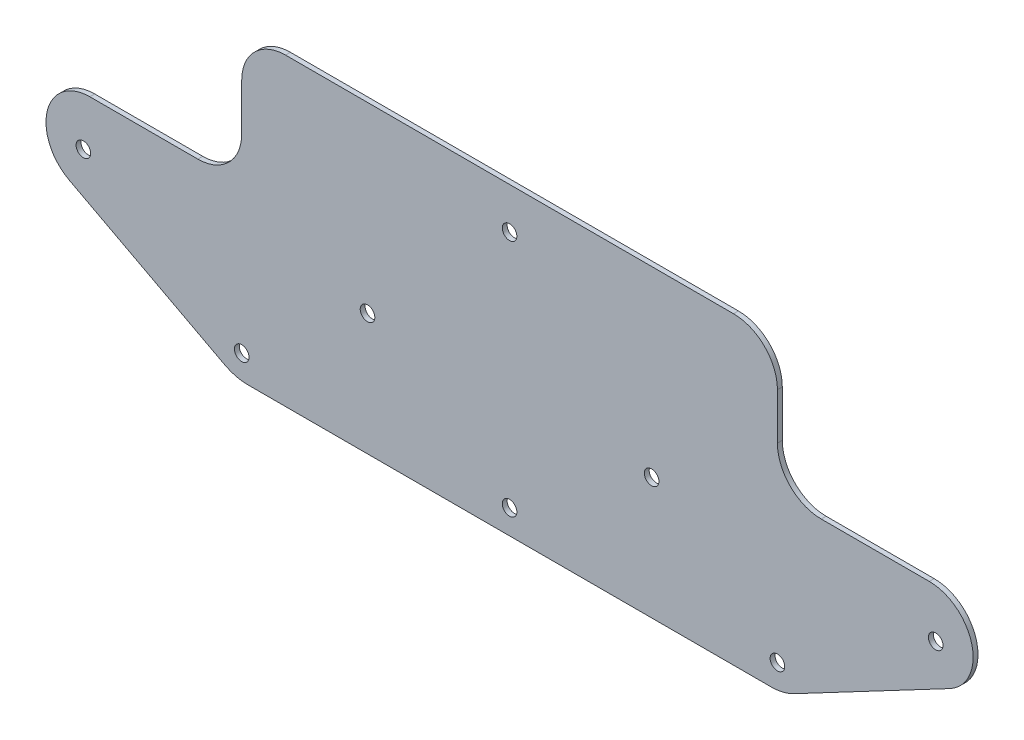
ISO-10303-21;
HEADER;
FILE_DESCRIPTION(('STEP AP214'),'2;1');
FILE_NAME('part.step','',(''),(''),'','','');
FILE_SCHEMA(('AUTOMOTIVE_DESIGN { 1 0 10303 214 1 1 1 1 }'));
ENDSEC;
DATA;
#1=APPLICATION_CONTEXT('core data for automotive mechanical design processes');
#2=APPLICATION_PROTOCOL_DEFINITION('international standard','automotive_design',2000,#1);
#3=PRODUCT_CONTEXT('',#1,'mechanical');
#4=PRODUCT('Part','Part','',(#3));
#5=PRODUCT_RELATED_PRODUCT_CATEGORY('part','',(#4));
#6=PRODUCT_DEFINITION_FORMATION('','',#4);
#7=PRODUCT_DEFINITION_CONTEXT('part definition',#1,'design');
#8=PRODUCT_DEFINITION('design','',#6,#7);
#9=PRODUCT_DEFINITION_SHAPE('','',#8);
#10=(LENGTH_UNIT() NAMED_UNIT(*) SI_UNIT(.MILLI.,.METRE.));
#11=(NAMED_UNIT(*) PLANE_ANGLE_UNIT() SI_UNIT($,.RADIAN.));
#12=(NAMED_UNIT(*) SI_UNIT($,.STERADIAN.) SOLID_ANGLE_UNIT());
#13=UNCERTAINTY_MEASURE_WITH_UNIT(LENGTH_MEASURE(1.E-05),#10,'distance_accuracy_value','');
#14=(GEOMETRIC_REPRESENTATION_CONTEXT(3) GLOBAL_UNCERTAINTY_ASSIGNED_CONTEXT((#13)) GLOBAL_UNIT_ASSIGNED_CONTEXT((#10,
#11,#12)) REPRESENTATION_CONTEXT('',''));
#15=CARTESIAN_POINT('',(0.,0.,0.));
#16=DIRECTION('',(0.,0.,1.));
#17=DIRECTION('',(1.,0.,0.));
#18=AXIS2_PLACEMENT_3D('',#15,#16,#17);
#19=CARTESIAN_POINT('',(0.,0.,2.));
#20=DIRECTION('',(0.,0.,-1.));
#21=DIRECTION('',(-1.,0.,0.));
#22=AXIS2_PLACEMENT_3D('',#19,#20,#21);
#23=PLANE('',#22);
#24=DIRECTION('',(0.884163522542753,-0.467177552334003,0.));
#25=VECTOR('',#24,1.);
#26=CARTESIAN_POINT('',(-244.958991581617,40.,2.));
#27=LINE('',#26,#25);
#28=CARTESIAN_POINT('',(-180.772782979186,6.08505659423045,2.));
#29=VERTEX_POINT('',#28);
#30=CARTESIAN_POINT('',(-116.864055255872,-27.6832704508551,2.));
#31=VERTEX_POINT('',#30);
#32=EDGE_CURVE('E180',#29,#31,#27,.T.);
#33=ORIENTED_EDGE('',*,*,#32,.T.);
#34=CARTESIAN_POINT('',(-107.520504209191,-10.,2.));
#35=DIRECTION('',(0.,0.,-1.));
#36=DIRECTION('',(-1.,0.,0.));
#37=AXIS2_PLACEMENT_3D('',#34,#35,#36);
#38=CIRCLE('',#37,20.);
#39=CARTESIAN_POINT('',(-107.520504209191,-30.,2.));
#40=VERTEX_POINT('',#39);
#41=EDGE_CURVE('E43',#31,#40,#38,.F.);
#42=ORIENTED_EDGE('',*,*,#41,.T.);
#43=DIRECTION('',(1.,0.,0.));
#44=VECTOR('',#43,1.);
#45=CARTESIAN_POINT('',(-112.479495790809,-30.,2.));
#46=LINE('',#45,#44);
#47=CARTESIAN_POINT('',(107.520504209191,-30.,2.));
#48=VERTEX_POINT('',#47);
#49=EDGE_CURVE('E183',#40,#48,#46,.T.);
#50=ORIENTED_EDGE('',*,*,#49,.T.);
#51=CARTESIAN_POINT('',(107.520504209191,-9.99999999999999,2.));
#52=DIRECTION('',(0.,0.,-1.));
#53=DIRECTION('',(-1.,0.,0.));
#54=AXIS2_PLACEMENT_3D('',#51,#52,#53);
#55=CIRCLE('',#54,20.);
#56=CARTESIAN_POINT('',(116.864055255872,-27.6832704508551,2.));
#57=VERTEX_POINT('',#56);
#58=EDGE_CURVE('E50',#48,#57,#55,.F.);
#59=ORIENTED_EDGE('',*,*,#58,.T.);
#60=DIRECTION('',(0.884163522542753,0.467177552334003,0.));
#61=VECTOR('',#60,1.);
#62=CARTESIAN_POINT('',(244.958991581617,40.,2.));
#63=LINE('',#62,#61);
#64=CARTESIAN_POINT('',(180.772782979186,6.08505659423045,2.));
#65=VERTEX_POINT('',#64);
#66=EDGE_CURVE('E253',#57,#65,#63,.T.);
#67=ORIENTED_EDGE('',*,*,#66,.T.);
#68=CARTESIAN_POINT('',(172.363587037174,22.,2.));
#69=DIRECTION('',(0.,0.,-1.));
#70=DIRECTION('',(-1.,0.,0.));
#71=AXIS2_PLACEMENT_3D('',#68,#69,#70);
#72=CIRCLE('',#71,18.);
#73=CARTESIAN_POINT('',(172.363587037174,40.,2.));
#74=VERTEX_POINT('',#73);
#75=EDGE_CURVE('E208',#65,#74,#72,.F.);
#76=ORIENTED_EDGE('',*,*,#75,.T.);
#77=DIRECTION('',(-1.,0.,0.));
#78=VECTOR('',#77,1.);
#79=CARTESIAN_POINT('',(110.,40.,2.));
#80=LINE('',#79,#78);
#81=CARTESIAN_POINT('',(128.,40.,2.));
#82=VERTEX_POINT('',#81);
#83=EDGE_CURVE('E299',#74,#82,#80,.T.);
#84=ORIENTED_EDGE('',*,*,#83,.T.);
#85=CARTESIAN_POINT('',(128.,58.,2.));
#86=DIRECTION('',(0.,0.,-1.));
#87=DIRECTION('',(-1.,0.,0.));
#88=AXIS2_PLACEMENT_3D('',#85,#86,#87);
#89=CIRCLE('',#88,18.);
#90=CARTESIAN_POINT('',(110.,58.,2.));
#91=VERTEX_POINT('',#90);
#92=EDGE_CURVE('E232',#82,#91,#89,.T.);
#93=ORIENTED_EDGE('',*,*,#92,.T.);
#94=DIRECTION('',(0.,1.,0.));
#95=VECTOR('',#94,1.);
#96=CARTESIAN_POINT('',(110.,95.0000000000001,2.));
#97=LINE('',#96,#95);
#98=CARTESIAN_POINT('',(110.,77.,2.));
#99=VERTEX_POINT('',#98);
#100=EDGE_CURVE('E294',#91,#99,#97,.T.);
#101=ORIENTED_EDGE('',*,*,#100,.T.);
#102=CARTESIAN_POINT('',(92.0000000000002,77.0000000000001,2.));
#103=DIRECTION('',(0.,0.,-1.));
#104=DIRECTION('',(-1.,0.,0.));
#105=AXIS2_PLACEMENT_3D('',#102,#103,#104);
#106=CIRCLE('',#105,18.);
#107=CARTESIAN_POINT('',(92.0000000000002,95.0000000000001,2.));
#108=VERTEX_POINT('',#107);
#109=EDGE_CURVE('E210',#99,#108,#106,.F.);
#110=ORIENTED_EDGE('',*,*,#109,.T.);
#111=DIRECTION('',(-1.,0.,0.));
#112=VECTOR('',#111,1.);
#113=CARTESIAN_POINT('',(110.,95.0000000000001,2.));
#114=LINE('',#113,#112);
#115=CARTESIAN_POINT('',(-92.0000000000001,95.0000000000001,2.));
#116=VERTEX_POINT('',#115);
#117=EDGE_CURVE('E291',#108,#116,#114,.T.);
#118=ORIENTED_EDGE('',*,*,#117,.T.);
#119=CARTESIAN_POINT('',(-92.0000000000001,77.0000000000001,2.));
#120=DIRECTION('',(0.,0.,-1.));
#121=DIRECTION('',(-1.,0.,0.));
#122=AXIS2_PLACEMENT_3D('',#119,#120,#121);
#123=CIRCLE('',#122,18.);
#124=CARTESIAN_POINT('',(-110.,77.0000000000001,2.));
#125=VERTEX_POINT('',#124);
#126=EDGE_CURVE('E212',#116,#125,#123,.F.);
#127=ORIENTED_EDGE('',*,*,#126,.T.);
#128=DIRECTION('',(0.,-1.,0.));
#129=VECTOR('',#128,1.);
#130=CARTESIAN_POINT('',(-110.,95.0000000000001,2.));
#131=LINE('',#130,#129);
#132=CARTESIAN_POINT('',(-110.,58.,2.));
#133=VERTEX_POINT('',#132);
#134=EDGE_CURVE('E290',#125,#133,#131,.T.);
#135=ORIENTED_EDGE('',*,*,#134,.T.);
#136=CARTESIAN_POINT('',(-128.,58.,2.));
#137=DIRECTION('',(0.,0.,-1.));
#138=DIRECTION('',(-1.,0.,0.));
#139=AXIS2_PLACEMENT_3D('',#136,#137,#138);
#140=CIRCLE('',#139,18.);
#141=CARTESIAN_POINT('',(-128.,40.,2.));
#142=VERTEX_POINT('',#141);
#143=EDGE_CURVE('E161',#133,#142,#140,.T.);
#144=ORIENTED_EDGE('',*,*,#143,.T.);
#145=DIRECTION('',(-1.,0.,0.));
#146=VECTOR('',#145,1.);
#147=CARTESIAN_POINT('',(-244.958991581617,40.,2.));
#148=LINE('',#147,#146);
#149=CARTESIAN_POINT('',(-172.363587037174,40.,2.));
#150=VERTEX_POINT('',#149);
#151=EDGE_CURVE('E171',#142,#150,#148,.T.);
#152=ORIENTED_EDGE('',*,*,#151,.T.);
#153=CARTESIAN_POINT('',(-172.363587037174,22.,2.));
#154=DIRECTION('',(0.,0.,-1.));
#155=DIRECTION('',(-1.,0.,0.));
#156=AXIS2_PLACEMENT_3D('',#153,#154,#155);
#157=CIRCLE('',#156,18.);
#158=EDGE_CURVE('E206',#150,#29,#157,.F.);
#159=ORIENTED_EDGE('',*,*,#158,.T.);
#160=EDGE_LOOP('',(#33,#42,#50,#59,#67,#76,#84,#93,#101,#110,#118,#127,#135,#144,#152,#159));
#161=FACE_BOUND('',#160,.T.);
#162=CARTESIAN_POINT('',(0.,-20.,2.));
#163=DIRECTION('',(0.,0.,1.));
#164=DIRECTION('',(1.,0.,0.));
#165=AXIS2_PLACEMENT_3D('',#162,#163,#164);
#166=CIRCLE('',#165,3.);
#167=CARTESIAN_POINT('',(3.00000000000003,-20.,2.));
#168=VERTEX_POINT('',#167);
#169=EDGE_CURVE('E260',#168,#168,#166,.T.);
#170=ORIENTED_EDGE('',*,*,#169,.F.);
#171=EDGE_LOOP('',(#170));
#172=FACE_BOUND('',#171,.T.);
#173=CARTESIAN_POINT('',(-175.,20.,2.));
#174=DIRECTION('',(0.,0.,1.));
#175=DIRECTION('',(1.,0.,0.));
#176=AXIS2_PLACEMENT_3D('',#173,#174,#175);
#177=CIRCLE('',#176,2.99999999999999);
#178=CARTESIAN_POINT('',(-172.,20.,2.));
#179=VERTEX_POINT('',#178);
#180=EDGE_CURVE('E304',#179,#179,#177,.T.);
#181=ORIENTED_EDGE('',*,*,#180,.F.);
#182=EDGE_LOOP('',(#181));
#183=FACE_BOUND('',#182,.T.);
#184=CARTESIAN_POINT('',(-110.,-20.,2.));
#185=DIRECTION('',(0.,0.,1.));
#186=DIRECTION('',(1.,0.,0.));
#187=AXIS2_PLACEMENT_3D('',#184,#185,#186);
#188=CIRCLE('',#187,3.00000000000001);
#189=CARTESIAN_POINT('',(-107.,-20.,2.));
#190=VERTEX_POINT('',#189);
#191=EDGE_CURVE('E309',#190,#190,#188,.T.);
#192=ORIENTED_EDGE('',*,*,#191,.F.);
#193=EDGE_LOOP('',(#192));
#194=FACE_BOUND('',#193,.T.);
#195=CARTESIAN_POINT('',(110.,-20.,2.));
#196=DIRECTION('',(0.,0.,1.));
#197=DIRECTION('',(1.,0.,0.));
#198=AXIS2_PLACEMENT_3D('',#195,#196,#197);
#199=CIRCLE('',#198,3.00000000000001);
#200=CARTESIAN_POINT('',(113.,-20.,2.));
#201=VERTEX_POINT('',#200);
#202=EDGE_CURVE('E315',#201,#201,#199,.T.);
#203=ORIENTED_EDGE('',*,*,#202,.F.);
#204=EDGE_LOOP('',(#203));
#205=FACE_BOUND('',#204,.T.);
#206=CARTESIAN_POINT('',(175.,20.,2.));
#207=DIRECTION('',(0.,0.,1.));
#208=DIRECTION('',(1.,0.,0.));
#209=AXIS2_PLACEMENT_3D('',#206,#207,#208);
#210=CIRCLE('',#209,2.99999999999999);
#211=CARTESIAN_POINT('',(178.,20.,2.));
#212=VERTEX_POINT('',#211);
#213=EDGE_CURVE('E321',#212,#212,#210,.T.);
#214=ORIENTED_EDGE('',*,*,#213,.F.);
#215=EDGE_LOOP('',(#214));
#216=FACE_BOUND('',#215,.T.);
#217=CARTESIAN_POINT('',(-58.3333333333333,20.,2.));
#218=DIRECTION('',(0.,0.,1.));
#219=DIRECTION('',(1.,0.,0.));
#220=AXIS2_PLACEMENT_3D('',#217,#218,#219);
#221=CIRCLE('',#220,3.);
#222=CARTESIAN_POINT('',(-55.3333333333333,20.,2.));
#223=VERTEX_POINT('',#222);
#224=EDGE_CURVE('E327',#223,#223,#221,.T.);
#225=ORIENTED_EDGE('',*,*,#224,.F.);
#226=EDGE_LOOP('',(#225));
#227=FACE_BOUND('',#226,.T.);
#228=CARTESIAN_POINT('',(58.3333333333334,20.,2.));
#229=DIRECTION('',(0.,0.,1.));
#230=DIRECTION('',(1.,0.,0.));
#231=AXIS2_PLACEMENT_3D('',#228,#229,#230);
#232=CIRCLE('',#231,3.00000000000001);
#233=CARTESIAN_POINT('',(61.3333333333334,20.,2.));
#234=VERTEX_POINT('',#233);
#235=EDGE_CURVE('E333',#234,#234,#232,.T.);
#236=ORIENTED_EDGE('',*,*,#235,.F.);
#237=EDGE_LOOP('',(#236));
#238=FACE_BOUND('',#237,.T.);
#239=CARTESIAN_POINT('',(0.,78.03,2.));
#240=DIRECTION('',(0.,0.,1.));
#241=DIRECTION('',(1.,0.,0.));
#242=AXIS2_PLACEMENT_3D('',#239,#240,#241);
#243=CIRCLE('',#242,3.);
#244=CARTESIAN_POINT('',(3.,78.03,2.));
#245=VERTEX_POINT('',#244);
#246=EDGE_CURVE('E339',#245,#245,#243,.T.);
#247=ORIENTED_EDGE('',*,*,#246,.F.);
#248=EDGE_LOOP('',(#247));
#249=FACE_BOUND('',#248,.T.);
#250=ADVANCED_FACE('F35',(#161,#172,#183,#194,#205,#216,#227,#238,#249),#23,.F.);
#251=CARTESIAN_POINT('',(0.,0.,0.));
#252=DIRECTION('',(0.,0.,-1.));
#253=DIRECTION('',(-1.,0.,0.));
#254=AXIS2_PLACEMENT_3D('',#251,#252,#253);
#255=PLANE('',#254);
#256=CARTESIAN_POINT('',(58.3333333333334,20.,0.));
#257=DIRECTION('',(0.,0.,1.));
#258=DIRECTION('',(1.,0.,0.));
#259=AXIS2_PLACEMENT_3D('',#256,#257,#258);
#260=CIRCLE('',#259,3.00000000000001);
#261=CARTESIAN_POINT('',(61.3333333333334,20.,0.));
#262=VERTEX_POINT('',#261);
#263=EDGE_CURVE('E336',#262,#262,#260,.T.);
#264=ORIENTED_EDGE('',*,*,#263,.T.);
#265=EDGE_LOOP('',(#264));
#266=FACE_BOUND('',#265,.T.);
#267=CARTESIAN_POINT('',(175.,20.,0.));
#268=DIRECTION('',(0.,0.,1.));
#269=DIRECTION('',(1.,0.,0.));
#270=AXIS2_PLACEMENT_3D('',#267,#268,#269);
#271=CIRCLE('',#270,2.99999999999999);
#272=CARTESIAN_POINT('',(178.,20.,0.));
#273=VERTEX_POINT('',#272);
#274=EDGE_CURVE('E324',#273,#273,#271,.T.);
#275=ORIENTED_EDGE('',*,*,#274,.T.);
#276=EDGE_LOOP('',(#275));
#277=FACE_BOUND('',#276,.T.);
#278=CARTESIAN_POINT('',(-110.,-20.,0.));
#279=DIRECTION('',(0.,0.,1.));
#280=DIRECTION('',(1.,0.,0.));
#281=AXIS2_PLACEMENT_3D('',#278,#279,#280);
#282=CIRCLE('',#281,3.00000000000001);
#283=CARTESIAN_POINT('',(-107.,-20.,0.));
#284=VERTEX_POINT('',#283);
#285=EDGE_CURVE('E312',#284,#284,#282,.T.);
#286=ORIENTED_EDGE('',*,*,#285,.T.);
#287=EDGE_LOOP('',(#286));
#288=FACE_BOUND('',#287,.T.);
#289=CARTESIAN_POINT('',(0.,-20.,0.));
#290=DIRECTION('',(0.,0.,1.));
#291=DIRECTION('',(1.,0.,0.));
#292=AXIS2_PLACEMENT_3D('',#289,#290,#291);
#293=CIRCLE('',#292,3.);
#294=CARTESIAN_POINT('',(3.00000000000003,-20.,0.));
#295=VERTEX_POINT('',#294);
#296=EDGE_CURVE('E265',#295,#295,#293,.T.);
#297=ORIENTED_EDGE('',*,*,#296,.T.);
#298=EDGE_LOOP('',(#297));
#299=FACE_BOUND('',#298,.T.);
#300=DIRECTION('',(1.,0.,0.));
#301=VECTOR('',#300,1.);
#302=CARTESIAN_POINT('',(-112.479495790809,-30.,0.));
#303=LINE('',#302,#301);
#304=CARTESIAN_POINT('',(-107.520504209191,-30.,0.));
#305=VERTEX_POINT('',#304);
#306=CARTESIAN_POINT('',(107.520504209191,-30.,0.));
#307=VERTEX_POINT('',#306);
#308=EDGE_CURVE('E257',#305,#307,#303,.T.);
#309=ORIENTED_EDGE('',*,*,#308,.F.);
#310=CARTESIAN_POINT('',(-107.520504209191,-10.,0.));
#311=DIRECTION('',(0.,0.,-1.));
#312=DIRECTION('',(-1.,0.,0.));
#313=AXIS2_PLACEMENT_3D('',#310,#311,#312);
#314=CIRCLE('',#313,20.);
#315=CARTESIAN_POINT('',(-116.864055255872,-27.6832704508551,0.));
#316=VERTEX_POINT('',#315);
#317=EDGE_CURVE('E241',#305,#316,#314,.T.);
#318=ORIENTED_EDGE('',*,*,#317,.T.);
#319=DIRECTION('',(0.884163522542753,-0.467177552334003,0.));
#320=VECTOR('',#319,1.);
#321=CARTESIAN_POINT('',(-244.958991581617,40.,0.));
#322=LINE('',#321,#320);
#323=CARTESIAN_POINT('',(-180.772782979186,6.08505659423045,0.));
#324=VERTEX_POINT('',#323);
#325=EDGE_CURVE('E256',#324,#316,#322,.T.);
#326=ORIENTED_EDGE('',*,*,#325,.F.);
#327=CARTESIAN_POINT('',(-172.363587037174,22.,0.));
#328=DIRECTION('',(0.,0.,-1.));
#329=DIRECTION('',(-1.,0.,0.));
#330=AXIS2_PLACEMENT_3D('',#327,#328,#329);
#331=CIRCLE('',#330,18.);
#332=CARTESIAN_POINT('',(-172.363587037174,40.,0.));
#333=VERTEX_POINT('',#332);
#334=EDGE_CURVE('E179',#324,#333,#331,.T.);
#335=ORIENTED_EDGE('',*,*,#334,.T.);
#336=DIRECTION('',(-1.,0.,0.));
#337=VECTOR('',#336,1.);
#338=CARTESIAN_POINT('',(-244.958991581617,40.,0.));
#339=LINE('',#338,#337);
#340=CARTESIAN_POINT('',(-128.,40.,0.));
#341=VERTEX_POINT('',#340);
#342=EDGE_CURVE('E168',#341,#333,#339,.T.);
#343=ORIENTED_EDGE('',*,*,#342,.F.);
#344=CARTESIAN_POINT('',(-128.,58.,0.));
#345=DIRECTION('',(0.,0.,-1.));
#346=DIRECTION('',(-1.,0.,0.));
#347=AXIS2_PLACEMENT_3D('',#344,#345,#346);
#348=CIRCLE('',#347,18.);
#349=CARTESIAN_POINT('',(-110.,58.,0.));
#350=VERTEX_POINT('',#349);
#351=EDGE_CURVE('E151',#341,#350,#348,.F.);
#352=ORIENTED_EDGE('',*,*,#351,.T.);
#353=DIRECTION('',(0.,-1.,0.));
#354=VECTOR('',#353,1.);
#355=CARTESIAN_POINT('',(-110.,95.0000000000001,0.));
#356=LINE('',#355,#354);
#357=CARTESIAN_POINT('',(-110.,77.0000000000001,0.));
#358=VERTEX_POINT('',#357);
#359=EDGE_CURVE('E181',#358,#350,#356,.T.);
#360=ORIENTED_EDGE('',*,*,#359,.F.);
#361=CARTESIAN_POINT('',(-92.0000000000001,77.0000000000001,0.));
#362=DIRECTION('',(0.,0.,-1.));
#363=DIRECTION('',(-1.,0.,0.));
#364=AXIS2_PLACEMENT_3D('',#361,#362,#363);
#365=CIRCLE('',#364,18.);
#366=CARTESIAN_POINT('',(-92.0000000000001,95.0000000000001,0.));
#367=VERTEX_POINT('',#366);
#368=EDGE_CURVE('E199',#358,#367,#365,.T.);
#369=ORIENTED_EDGE('',*,*,#368,.T.);
#370=DIRECTION('',(-1.,0.,0.));
#371=VECTOR('',#370,1.);
#372=CARTESIAN_POINT('',(110.,95.0000000000001,0.));
#373=LINE('',#372,#371);
#374=CARTESIAN_POINT('',(92.0000000000002,95.0000000000001,0.));
#375=VERTEX_POINT('',#374);
#376=EDGE_CURVE('E185',#375,#367,#373,.T.);
#377=ORIENTED_EDGE('',*,*,#376,.F.);
#378=CARTESIAN_POINT('',(92.0000000000002,77.0000000000001,0.));
#379=DIRECTION('',(0.,0.,-1.));
#380=DIRECTION('',(-1.,0.,0.));
#381=AXIS2_PLACEMENT_3D('',#378,#379,#380);
#382=CIRCLE('',#381,18.);
#383=CARTESIAN_POINT('',(110.,77.,0.));
#384=VERTEX_POINT('',#383);
#385=EDGE_CURVE('E197',#375,#384,#382,.T.);
#386=ORIENTED_EDGE('',*,*,#385,.T.);
#387=DIRECTION('',(0.,1.,0.));
#388=VECTOR('',#387,1.);
#389=CARTESIAN_POINT('',(110.,95.0000000000001,0.));
#390=LINE('',#389,#388);
#391=CARTESIAN_POINT('',(110.,58.,0.));
#392=VERTEX_POINT('',#391);
#393=EDGE_CURVE('E274',#392,#384,#390,.T.);
#394=ORIENTED_EDGE('',*,*,#393,.F.);
#395=CARTESIAN_POINT('',(128.,58.,0.));
#396=DIRECTION('',(0.,0.,-1.));
#397=DIRECTION('',(-1.,0.,0.));
#398=AXIS2_PLACEMENT_3D('',#395,#396,#397);
#399=CIRCLE('',#398,18.);
#400=CARTESIAN_POINT('',(128.,40.,0.));
#401=VERTEX_POINT('',#400);
#402=EDGE_CURVE('E230',#392,#401,#399,.F.);
#403=ORIENTED_EDGE('',*,*,#402,.T.);
#404=DIRECTION('',(-1.,0.,0.));
#405=VECTOR('',#404,1.);
#406=CARTESIAN_POINT('',(110.,40.,0.));
#407=LINE('',#406,#405);
#408=CARTESIAN_POINT('',(172.363587037174,40.,0.));
#409=VERTEX_POINT('',#408);
#410=EDGE_CURVE('E271',#409,#401,#407,.T.);
#411=ORIENTED_EDGE('',*,*,#410,.F.);
#412=CARTESIAN_POINT('',(172.363587037174,22.,0.));
#413=DIRECTION('',(0.,0.,-1.));
#414=DIRECTION('',(-1.,0.,0.));
#415=AXIS2_PLACEMENT_3D('',#412,#413,#414);
#416=CIRCLE('',#415,18.);
#417=CARTESIAN_POINT('',(180.772782979186,6.08505659423045,0.));
#418=VERTEX_POINT('',#417);
#419=EDGE_CURVE('E194',#409,#418,#416,.T.);
#420=ORIENTED_EDGE('',*,*,#419,.T.);
#421=DIRECTION('',(0.884163522542753,0.467177552334003,0.));
#422=VECTOR('',#421,1.);
#423=CARTESIAN_POINT('',(244.958991581617,40.,0.));
#424=LINE('',#423,#422);
#425=CARTESIAN_POINT('',(116.864055255872,-27.6832704508551,0.));
#426=VERTEX_POINT('',#425);
#427=EDGE_CURVE('E262',#426,#418,#424,.T.);
#428=ORIENTED_EDGE('',*,*,#427,.F.);
#429=CARTESIAN_POINT('',(107.520504209191,-9.99999999999999,0.));
#430=DIRECTION('',(0.,0.,-1.));
#431=DIRECTION('',(-1.,0.,0.));
#432=AXIS2_PLACEMENT_3D('',#429,#430,#431);
#433=CIRCLE('',#432,20.);
#434=EDGE_CURVE('E239',#426,#307,#433,.T.);
#435=ORIENTED_EDGE('',*,*,#434,.T.);
#436=EDGE_LOOP('',(#309,#318,#326,#335,#343,#352,#360,#369,#377,#386,#394,#403,#411,#420,#428,#435));
#437=FACE_BOUND('',#436,.T.);
#438=CARTESIAN_POINT('',(-175.,20.,0.));
#439=DIRECTION('',(0.,0.,1.));
#440=DIRECTION('',(1.,0.,0.));
#441=AXIS2_PLACEMENT_3D('',#438,#439,#440);
#442=CIRCLE('',#441,2.99999999999999);
#443=CARTESIAN_POINT('',(-172.,20.,0.));
#444=VERTEX_POINT('',#443);
#445=EDGE_CURVE('E306',#444,#444,#442,.T.);
#446=ORIENTED_EDGE('',*,*,#445,.T.);
#447=EDGE_LOOP('',(#446));
#448=FACE_BOUND('',#447,.T.);
#449=CARTESIAN_POINT('',(110.,-20.,0.));
#450=DIRECTION('',(0.,0.,1.));
#451=DIRECTION('',(1.,0.,0.));
#452=AXIS2_PLACEMENT_3D('',#449,#450,#451);
#453=CIRCLE('',#452,3.00000000000001);
#454=CARTESIAN_POINT('',(113.,-20.,0.));
#455=VERTEX_POINT('',#454);
#456=EDGE_CURVE('E318',#455,#455,#453,.T.);
#457=ORIENTED_EDGE('',*,*,#456,.T.);
#458=EDGE_LOOP('',(#457));
#459=FACE_BOUND('',#458,.T.);
#460=CARTESIAN_POINT('',(-58.3333333333333,20.,0.));
#461=DIRECTION('',(0.,0.,1.));
#462=DIRECTION('',(1.,0.,0.));
#463=AXIS2_PLACEMENT_3D('',#460,#461,#462);
#464=CIRCLE('',#463,3.);
#465=CARTESIAN_POINT('',(-55.3333333333333,20.,0.));
#466=VERTEX_POINT('',#465);
#467=EDGE_CURVE('E330',#466,#466,#464,.T.);
#468=ORIENTED_EDGE('',*,*,#467,.T.);
#469=EDGE_LOOP('',(#468));
#470=FACE_BOUND('',#469,.T.);
#471=CARTESIAN_POINT('',(0.,78.03,0.));
#472=DIRECTION('',(0.,0.,1.));
#473=DIRECTION('',(1.,0.,0.));
#474=AXIS2_PLACEMENT_3D('',#471,#472,#473);
#475=CIRCLE('',#474,3.);
#476=CARTESIAN_POINT('',(3.,78.03,0.));
#477=VERTEX_POINT('',#476);
#478=EDGE_CURVE('E342',#477,#477,#475,.T.);
#479=ORIENTED_EDGE('',*,*,#478,.T.);
#480=EDGE_LOOP('',(#479));
#481=FACE_BOUND('',#480,.T.);
#482=ADVANCED_FACE('F176',(#266,#277,#288,#299,#437,#448,#459,#470,#481),#255,.T.);
#483=CARTESIAN_POINT('',(-244.958991581617,40.,2.));
#484=DIRECTION('',(0.467177552334003,0.884163522542753,0.));
#485=DIRECTION('',(-0.884163522542753,0.467177552334003,0.));
#486=AXIS2_PLACEMENT_3D('',#483,#484,#485);
#487=PLANE('',#486);
#488=ORIENTED_EDGE('',*,*,#325,.T.);
#489=DIRECTION('',(0.,0.,-1.));
#490=VECTOR('',#489,1.);
#491=CARTESIAN_POINT('',(-116.864055255872,-27.6832704508551,2.));
#492=LINE('',#491,#490);
#493=EDGE_CURVE('E58',#316,#31,#492,.F.);
#494=ORIENTED_EDGE('',*,*,#493,.T.);
#495=ORIENTED_EDGE('',*,*,#32,.F.);
#496=DIRECTION('',(0.,0.,-1.));
#497=VECTOR('',#496,1.);
#498=CARTESIAN_POINT('',(-180.772782979186,6.08505659423045,2.));
#499=LINE('',#498,#497);
#500=EDGE_CURVE('E162',#29,#324,#499,.T.);
#501=ORIENTED_EDGE('',*,*,#500,.T.);
#502=EDGE_LOOP('',(#488,#494,#495,#501));
#503=FACE_BOUND('',#502,.T.);
#504=ADVANCED_FACE('F258',(#503),#487,.F.);
#505=CARTESIAN_POINT('',(-112.479495790809,-30.,2.));
#506=DIRECTION('',(0.,1.,0.));
#507=DIRECTION('',(0.,0.,1.));
#508=AXIS2_PLACEMENT_3D('',#505,#506,#507);
#509=PLANE('',#508);
#510=ORIENTED_EDGE('',*,*,#49,.F.);
#511=DIRECTION('',(0.,0.,-1.));
#512=VECTOR('',#511,1.);
#513=CARTESIAN_POINT('',(-107.520504209191,-30.,2.));
#514=LINE('',#513,#512);
#515=EDGE_CURVE('E236',#40,#305,#514,.T.);
#516=ORIENTED_EDGE('',*,*,#515,.T.);
#517=ORIENTED_EDGE('',*,*,#308,.T.);
#518=DIRECTION('',(0.,0.,-1.));
#519=VECTOR('',#518,1.);
#520=CARTESIAN_POINT('',(107.520504209191,-30.,2.));
#521=LINE('',#520,#519);
#522=EDGE_CURVE('E234',#307,#48,#521,.F.);
#523=ORIENTED_EDGE('',*,*,#522,.T.);
#524=EDGE_LOOP('',(#510,#516,#517,#523));
#525=FACE_BOUND('',#524,.T.);
#526=ADVANCED_FACE('F250',(#525),#509,.F.);
#527=CARTESIAN_POINT('',(244.958991581617,40.,2.));
#528=DIRECTION('',(-0.467177552334003,0.884163522542753,0.));
#529=DIRECTION('',(-0.884163522542753,-0.467177552334003,0.));
#530=AXIS2_PLACEMENT_3D('',#527,#528,#529);
#531=PLANE('',#530);
#532=ORIENTED_EDGE('',*,*,#66,.F.);
#533=DIRECTION('',(0.,0.,-1.));
#534=VECTOR('',#533,1.);
#535=CARTESIAN_POINT('',(116.864055255872,-27.6832704508551,2.));
#536=LINE('',#535,#534);
#537=EDGE_CURVE('E11',#57,#426,#536,.T.);
#538=ORIENTED_EDGE('',*,*,#537,.T.);
#539=ORIENTED_EDGE('',*,*,#427,.T.);
#540=DIRECTION('',(0.,0.,-1.));
#541=VECTOR('',#540,1.);
#542=CARTESIAN_POINT('',(180.772782979186,6.08505659423045,2.));
#543=LINE('',#542,#541);
#544=EDGE_CURVE('E224',#418,#65,#543,.F.);
#545=ORIENTED_EDGE('',*,*,#544,.T.);
#546=EDGE_LOOP('',(#532,#538,#539,#545));
#547=FACE_BOUND('',#546,.T.);
#548=ADVANCED_FACE('F375',(#547),#531,.F.);
#549=CARTESIAN_POINT('',(110.,40.,2.));
#550=DIRECTION('',(0.,-1.,0.));
#551=DIRECTION('',(0.,0.,-1.));
#552=AXIS2_PLACEMENT_3D('',#549,#550,#551);
#553=PLANE('',#552);
#554=ORIENTED_EDGE('',*,*,#410,.T.);
#555=DIRECTION('',(0.,0.,-1.));
#556=VECTOR('',#555,1.);
#557=CARTESIAN_POINT('',(128.,40.,2.));
#558=LINE('',#557,#556);
#559=EDGE_CURVE('E222',#401,#82,#558,.F.);
#560=ORIENTED_EDGE('',*,*,#559,.T.);
#561=ORIENTED_EDGE('',*,*,#83,.F.);
#562=DIRECTION('',(0.,0.,-1.));
#563=VECTOR('',#562,1.);
#564=CARTESIAN_POINT('',(172.363587037174,40.,2.));
#565=LINE('',#564,#563);
#566=EDGE_CURVE('E219',#74,#409,#565,.T.);
#567=ORIENTED_EDGE('',*,*,#566,.T.);
#568=EDGE_LOOP('',(#554,#560,#561,#567));
#569=FACE_BOUND('',#568,.T.);
#570=ADVANCED_FACE('F371',(#569),#553,.F.);
#571=CARTESIAN_POINT('',(110.,95.0000000000001,2.));
#572=DIRECTION('',(-1.,0.,0.));
#573=DIRECTION('',(0.,-1.,0.));
#574=AXIS2_PLACEMENT_3D('',#571,#572,#573);
#575=PLANE('',#574);
#576=ORIENTED_EDGE('',*,*,#393,.T.);
#577=DIRECTION('',(0.,0.,-1.));
#578=VECTOR('',#577,1.);
#579=CARTESIAN_POINT('',(110.,77.,2.));
#580=LINE('',#579,#578);
#581=EDGE_CURVE('E217',#384,#99,#580,.F.);
#582=ORIENTED_EDGE('',*,*,#581,.T.);
#583=ORIENTED_EDGE('',*,*,#100,.F.);
#584=DIRECTION('',(0.,0.,-1.));
#585=VECTOR('',#584,1.);
#586=CARTESIAN_POINT('',(110.,58.,0.));
#587=LINE('',#586,#585);
#588=EDGE_CURVE('E214',#91,#392,#587,.T.);
#589=ORIENTED_EDGE('',*,*,#588,.T.);
#590=EDGE_LOOP('',(#576,#582,#583,#589));
#591=FACE_BOUND('',#590,.T.);
#592=ADVANCED_FACE('F368',(#591),#575,.F.);
#593=CARTESIAN_POINT('',(110.,95.0000000000001,2.));
#594=DIRECTION('',(0.,-1.,0.));
#595=DIRECTION('',(1.,0.,0.));
#596=AXIS2_PLACEMENT_3D('',#593,#594,#595);
#597=PLANE('',#596);
#598=ORIENTED_EDGE('',*,*,#376,.T.);
#599=DIRECTION('',(0.,0.,-1.));
#600=VECTOR('',#599,1.);
#601=CARTESIAN_POINT('',(-92.0000000000001,95.0000000000001,2.));
#602=LINE('',#601,#600);
#603=EDGE_CURVE('E204',#367,#116,#602,.F.);
#604=ORIENTED_EDGE('',*,*,#603,.T.);
#605=ORIENTED_EDGE('',*,*,#117,.F.);
#606=DIRECTION('',(0.,0.,-1.));
#607=VECTOR('',#606,1.);
#608=CARTESIAN_POINT('',(92.0000000000002,95.0000000000001,2.));
#609=LINE('',#608,#607);
#610=EDGE_CURVE('E201',#108,#375,#609,.T.);
#611=ORIENTED_EDGE('',*,*,#610,.T.);
#612=EDGE_LOOP('',(#598,#604,#605,#611));
#613=FACE_BOUND('',#612,.T.);
#614=ADVANCED_FACE('F280',(#613),#597,.F.);
#615=CARTESIAN_POINT('',(-110.,95.0000000000001,2.));
#616=DIRECTION('',(1.,0.,0.));
#617=DIRECTION('',(0.,1.,0.));
#618=AXIS2_PLACEMENT_3D('',#615,#616,#617);
#619=PLANE('',#618);
#620=ORIENTED_EDGE('',*,*,#359,.T.);
#621=DIRECTION('',(0.,0.,-1.));
#622=VECTOR('',#621,1.);
#623=CARTESIAN_POINT('',(-110.,58.,2.));
#624=LINE('',#623,#622);
#625=EDGE_CURVE('E156',#350,#133,#624,.F.);
#626=ORIENTED_EDGE('',*,*,#625,.T.);
#627=ORIENTED_EDGE('',*,*,#134,.F.);
#628=DIRECTION('',(0.,0.,-1.));
#629=VECTOR('',#628,1.);
#630=CARTESIAN_POINT('',(-110.,77.0000000000001,2.));
#631=LINE('',#630,#629);
#632=EDGE_CURVE('E172',#125,#358,#631,.T.);
#633=ORIENTED_EDGE('',*,*,#632,.T.);
#634=EDGE_LOOP('',(#620,#626,#627,#633));
#635=FACE_BOUND('',#634,.T.);
#636=ADVANCED_FACE('F293',(#635),#619,.F.);
#637=CARTESIAN_POINT('',(-244.958991581617,40.,2.));
#638=DIRECTION('',(0.,-1.,0.));
#639=DIRECTION('',(0.,0.,-1.));
#640=AXIS2_PLACEMENT_3D('',#637,#638,#639);
#641=PLANE('',#640);
#642=ORIENTED_EDGE('',*,*,#151,.F.);
#643=DIRECTION('',(0.,0.,-1.));
#644=VECTOR('',#643,1.);
#645=CARTESIAN_POINT('',(-128.,40.,0.));
#646=LINE('',#645,#644);
#647=EDGE_CURVE('E155',#142,#341,#646,.T.);
#648=ORIENTED_EDGE('',*,*,#647,.T.);
#649=ORIENTED_EDGE('',*,*,#342,.T.);
#650=DIRECTION('',(0.,0.,-1.));
#651=VECTOR('',#650,1.);
#652=CARTESIAN_POINT('',(-172.363587037174,40.,2.));
#653=LINE('',#652,#651);
#654=EDGE_CURVE('E173',#333,#150,#653,.F.);
#655=ORIENTED_EDGE('',*,*,#654,.T.);
#656=EDGE_LOOP('',(#642,#648,#649,#655));
#657=FACE_BOUND('',#656,.T.);
#658=ADVANCED_FACE('F167',(#657),#641,.F.);
#659=CARTESIAN_POINT('',(0.,-20.,2.));
#660=DIRECTION('',(0.,0.,-1.));
#661=DIRECTION('',(-1.,0.,0.));
#662=AXIS2_PLACEMENT_3D('',#659,#660,#661);
#663=CYLINDRICAL_SURFACE('',#662,3.);
#664=ORIENTED_EDGE('',*,*,#169,.T.);
#665=EDGE_LOOP('',(#664));
#666=FACE_BOUND('',#665,.T.);
#667=ORIENTED_EDGE('',*,*,#296,.F.);
#668=EDGE_LOOP('',(#667));
#669=FACE_BOUND('',#668,.T.);
#670=ADVANCED_FACE('F359',(#666,#669),#663,.F.);
#671=CARTESIAN_POINT('',(-175.,20.,2.));
#672=DIRECTION('',(0.,0.,-1.));
#673=DIRECTION('',(-1.,0.,0.));
#674=AXIS2_PLACEMENT_3D('',#671,#672,#673);
#675=CYLINDRICAL_SURFACE('',#674,2.99999999999999);
#676=ORIENTED_EDGE('',*,*,#180,.T.);
#677=EDGE_LOOP('',(#676));
#678=FACE_BOUND('',#677,.T.);
#679=ORIENTED_EDGE('',*,*,#445,.F.);
#680=EDGE_LOOP('',(#679));
#681=FACE_BOUND('',#680,.T.);
#682=ADVANCED_FACE('F584',(#678,#681),#675,.F.);
#683=CARTESIAN_POINT('',(-110.,-20.,2.));
#684=DIRECTION('',(0.,0.,-1.));
#685=DIRECTION('',(-1.,0.,0.));
#686=AXIS2_PLACEMENT_3D('',#683,#684,#685);
#687=CYLINDRICAL_SURFACE('',#686,3.00000000000001);
#688=ORIENTED_EDGE('',*,*,#191,.T.);
#689=EDGE_LOOP('',(#688));
#690=FACE_BOUND('',#689,.T.);
#691=ORIENTED_EDGE('',*,*,#285,.F.);
#692=EDGE_LOOP('',(#691));
#693=FACE_BOUND('',#692,.T.);
#694=ADVANCED_FACE('F574',(#690,#693),#687,.F.);
#695=CARTESIAN_POINT('',(110.,-20.,2.));
#696=DIRECTION('',(0.,0.,-1.));
#697=DIRECTION('',(-1.,0.,0.));
#698=AXIS2_PLACEMENT_3D('',#695,#696,#697);
#699=CYLINDRICAL_SURFACE('',#698,3.00000000000001);
#700=ORIENTED_EDGE('',*,*,#202,.T.);
#701=EDGE_LOOP('',(#700));
#702=FACE_BOUND('',#701,.T.);
#703=ORIENTED_EDGE('',*,*,#456,.F.);
#704=EDGE_LOOP('',(#703));
#705=FACE_BOUND('',#704,.T.);
#706=ADVANCED_FACE('F564',(#702,#705),#699,.F.);
#707=CARTESIAN_POINT('',(175.,20.,2.));
#708=DIRECTION('',(0.,0.,-1.));
#709=DIRECTION('',(-1.,0.,0.));
#710=AXIS2_PLACEMENT_3D('',#707,#708,#709);
#711=CYLINDRICAL_SURFACE('',#710,2.99999999999999);
#712=ORIENTED_EDGE('',*,*,#213,.T.);
#713=EDGE_LOOP('',(#712));
#714=FACE_BOUND('',#713,.T.);
#715=ORIENTED_EDGE('',*,*,#274,.F.);
#716=EDGE_LOOP('',(#715));
#717=FACE_BOUND('',#716,.T.);
#718=ADVANCED_FACE('F554',(#714,#717),#711,.F.);
#719=CARTESIAN_POINT('',(-58.3333333333333,20.,2.));
#720=DIRECTION('',(0.,0.,-1.));
#721=DIRECTION('',(-1.,0.,0.));
#722=AXIS2_PLACEMENT_3D('',#719,#720,#721);
#723=CYLINDRICAL_SURFACE('',#722,3.);
#724=ORIENTED_EDGE('',*,*,#224,.T.);
#725=EDGE_LOOP('',(#724));
#726=FACE_BOUND('',#725,.T.);
#727=ORIENTED_EDGE('',*,*,#467,.F.);
#728=EDGE_LOOP('',(#727));
#729=FACE_BOUND('',#728,.T.);
#730=ADVANCED_FACE('F544',(#726,#729),#723,.F.);
#731=CARTESIAN_POINT('',(58.3333333333334,20.,2.));
#732=DIRECTION('',(0.,0.,-1.));
#733=DIRECTION('',(-1.,0.,0.));
#734=AXIS2_PLACEMENT_3D('',#731,#732,#733);
#735=CYLINDRICAL_SURFACE('',#734,3.00000000000001);
#736=ORIENTED_EDGE('',*,*,#235,.T.);
#737=EDGE_LOOP('',(#736));
#738=FACE_BOUND('',#737,.T.);
#739=ORIENTED_EDGE('',*,*,#263,.F.);
#740=EDGE_LOOP('',(#739));
#741=FACE_BOUND('',#740,.T.);
#742=ADVANCED_FACE('F535',(#738,#741),#735,.F.);
#743=CARTESIAN_POINT('',(0.,78.03,2.));
#744=DIRECTION('',(0.,0.,-1.));
#745=DIRECTION('',(-1.,0.,0.));
#746=AXIS2_PLACEMENT_3D('',#743,#744,#745);
#747=CYLINDRICAL_SURFACE('',#746,3.);
#748=ORIENTED_EDGE('',*,*,#246,.T.);
#749=EDGE_LOOP('',(#748));
#750=FACE_BOUND('',#749,.T.);
#751=ORIENTED_EDGE('',*,*,#478,.F.);
#752=EDGE_LOOP('',(#751));
#753=FACE_BOUND('',#752,.T.);
#754=ADVANCED_FACE('F348',(#750,#753),#747,.F.);
#755=CARTESIAN_POINT('',(-128.,58.,2.));
#756=DIRECTION('',(0.,0.,1.));
#757=DIRECTION('',(1.,0.,0.));
#758=AXIS2_PLACEMENT_3D('',#755,#756,#757);
#759=CYLINDRICAL_SURFACE('',#758,18.);
#760=ORIENTED_EDGE('',*,*,#143,.F.);
#761=ORIENTED_EDGE('',*,*,#625,.F.);
#762=ORIENTED_EDGE('',*,*,#351,.F.);
#763=ORIENTED_EDGE('',*,*,#647,.F.);
#764=EDGE_LOOP('',(#760,#761,#762,#763));
#765=FACE_BOUND('',#764,.T.);
#766=ADVANCED_FACE('F154',(#765),#759,.F.);
#767=CARTESIAN_POINT('',(-92.0000000000001,77.0000000000001,2.));
#768=DIRECTION('',(0.,0.,-1.));
#769=DIRECTION('',(-1.,0.,0.));
#770=AXIS2_PLACEMENT_3D('',#767,#768,#769);
#771=CYLINDRICAL_SURFACE('',#770,18.);
#772=ORIENTED_EDGE('',*,*,#126,.F.);
#773=ORIENTED_EDGE('',*,*,#603,.F.);
#774=ORIENTED_EDGE('',*,*,#368,.F.);
#775=ORIENTED_EDGE('',*,*,#632,.F.);
#776=EDGE_LOOP('',(#772,#773,#774,#775));
#777=FACE_BOUND('',#776,.T.);
#778=ADVANCED_FACE('F286',(#777),#771,.T.);
#779=CARTESIAN_POINT('',(92.0000000000002,77.0000000000001,2.));
#780=DIRECTION('',(0.,0.,-1.));
#781=DIRECTION('',(-1.,0.,0.));
#782=AXIS2_PLACEMENT_3D('',#779,#780,#781);
#783=CYLINDRICAL_SURFACE('',#782,18.);
#784=ORIENTED_EDGE('',*,*,#109,.F.);
#785=ORIENTED_EDGE('',*,*,#581,.F.);
#786=ORIENTED_EDGE('',*,*,#385,.F.);
#787=ORIENTED_EDGE('',*,*,#610,.F.);
#788=EDGE_LOOP('',(#784,#785,#786,#787));
#789=FACE_BOUND('',#788,.T.);
#790=ADVANCED_FACE('F388',(#789),#783,.T.);
#791=CARTESIAN_POINT('',(128.,58.,2.));
#792=DIRECTION('',(0.,0.,1.));
#793=DIRECTION('',(1.,0.,0.));
#794=AXIS2_PLACEMENT_3D('',#791,#792,#793);
#795=CYLINDRICAL_SURFACE('',#794,18.);
#796=ORIENTED_EDGE('',*,*,#92,.F.);
#797=ORIENTED_EDGE('',*,*,#559,.F.);
#798=ORIENTED_EDGE('',*,*,#402,.F.);
#799=ORIENTED_EDGE('',*,*,#588,.F.);
#800=EDGE_LOOP('',(#796,#797,#798,#799));
#801=FACE_BOUND('',#800,.T.);
#802=ADVANCED_FACE('F391',(#801),#795,.F.);
#803=CARTESIAN_POINT('',(172.363587037174,22.,2.));
#804=DIRECTION('',(0.,0.,-1.));
#805=DIRECTION('',(-1.,0.,0.));
#806=AXIS2_PLACEMENT_3D('',#803,#804,#805);
#807=CYLINDRICAL_SURFACE('',#806,18.);
#808=ORIENTED_EDGE('',*,*,#75,.F.);
#809=ORIENTED_EDGE('',*,*,#544,.F.);
#810=ORIENTED_EDGE('',*,*,#419,.F.);
#811=ORIENTED_EDGE('',*,*,#566,.F.);
#812=EDGE_LOOP('',(#808,#809,#810,#811));
#813=FACE_BOUND('',#812,.T.);
#814=ADVANCED_FACE('F395',(#813),#807,.T.);
#815=CARTESIAN_POINT('',(-172.363587037174,22.,2.));
#816=DIRECTION('',(0.,0.,-1.));
#817=DIRECTION('',(-1.,0.,0.));
#818=AXIS2_PLACEMENT_3D('',#815,#816,#817);
#819=CYLINDRICAL_SURFACE('',#818,18.);
#820=ORIENTED_EDGE('',*,*,#158,.F.);
#821=ORIENTED_EDGE('',*,*,#654,.F.);
#822=ORIENTED_EDGE('',*,*,#334,.F.);
#823=ORIENTED_EDGE('',*,*,#500,.F.);
#824=EDGE_LOOP('',(#820,#821,#822,#823));
#825=FACE_BOUND('',#824,.T.);
#826=ADVANCED_FACE('F399',(#825),#819,.T.);
#827=CARTESIAN_POINT('',(-107.520504209191,-10.,2.));
#828=DIRECTION('',(0.,0.,-1.));
#829=DIRECTION('',(-1.,0.,0.));
#830=AXIS2_PLACEMENT_3D('',#827,#828,#829);
#831=CYLINDRICAL_SURFACE('',#830,20.);
#832=ORIENTED_EDGE('',*,*,#41,.F.);
#833=ORIENTED_EDGE('',*,*,#493,.F.);
#834=ORIENTED_EDGE('',*,*,#317,.F.);
#835=ORIENTED_EDGE('',*,*,#515,.F.);
#836=EDGE_LOOP('',(#832,#833,#834,#835));
#837=FACE_BOUND('',#836,.T.);
#838=ADVANCED_FACE('F255',(#837),#831,.T.);
#839=CARTESIAN_POINT('',(107.520504209191,-9.99999999999999,2.));
#840=DIRECTION('',(0.,0.,-1.));
#841=DIRECTION('',(-1.,0.,0.));
#842=AXIS2_PLACEMENT_3D('',#839,#840,#841);
#843=CYLINDRICAL_SURFACE('',#842,20.);
#844=ORIENTED_EDGE('',*,*,#58,.F.);
#845=ORIENTED_EDGE('',*,*,#522,.F.);
#846=ORIENTED_EDGE('',*,*,#434,.F.);
#847=ORIENTED_EDGE('',*,*,#537,.F.);
#848=EDGE_LOOP('',(#844,#845,#846,#847));
#849=FACE_BOUND('',#848,.T.);
#850=ADVANCED_FACE('F37',(#849),#843,.T.);
#851=CLOSED_SHELL('',(#250,#482,#504,#526,#548,#570,#592,#614,#636,#658,#670,#682,#694,#706,
#718,#730,#742,#754,#766,#778,#790,#802,#814,#826,#838,#850));
#852=MANIFOLD_SOLID_BREP('B2',#851);
#853=ADVANCED_BREP_SHAPE_REPRESENTATION('',(#18,#852),#14);
#854=SHAPE_DEFINITION_REPRESENTATION(#9,#853);
ENDSEC;
END-ISO-10303-21;
